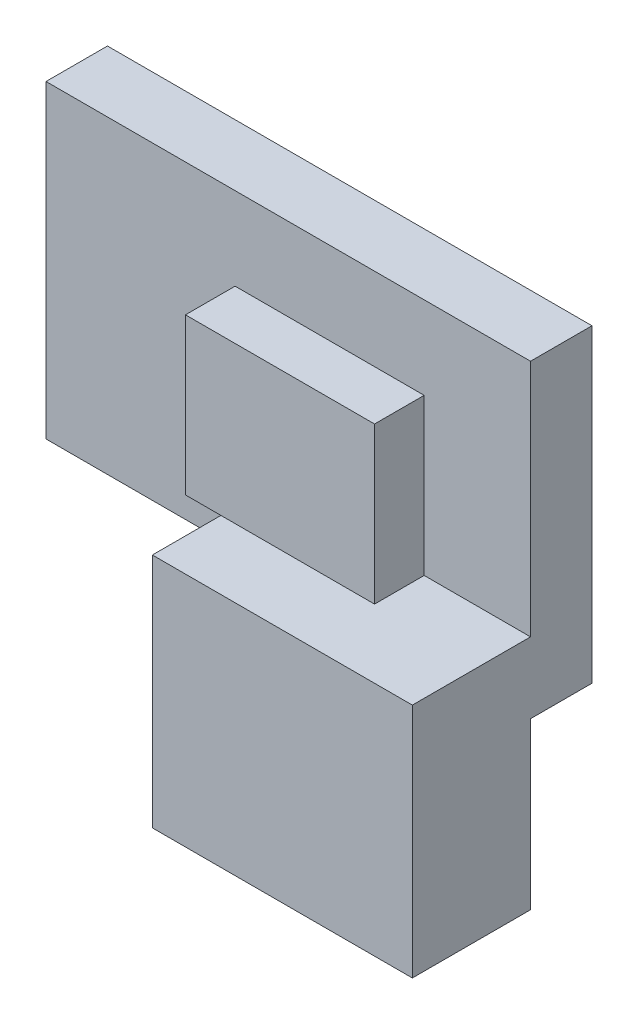
ISO-10303-21;
HEADER;
FILE_DESCRIPTION(('STEP AP214'),'2;1');
FILE_NAME('part.step','',(''),(''),'','','');
FILE_SCHEMA(('AUTOMOTIVE_DESIGN { 1 0 10303 214 1 1 1 1 }'));
ENDSEC;
DATA;
#1=APPLICATION_CONTEXT('core data for automotive mechanical design processes');
#2=APPLICATION_PROTOCOL_DEFINITION('international standard','automotive_design',2000,#1);
#3=PRODUCT_CONTEXT('',#1,'mechanical');
#4=PRODUCT('Part','Part','',(#3));
#5=PRODUCT_RELATED_PRODUCT_CATEGORY('part','',(#4));
#6=PRODUCT_DEFINITION_FORMATION('','',#4);
#7=PRODUCT_DEFINITION_CONTEXT('part definition',#1,'design');
#8=PRODUCT_DEFINITION('design','',#6,#7);
#9=PRODUCT_DEFINITION_SHAPE('','',#8);
#10=(LENGTH_UNIT() NAMED_UNIT(*) SI_UNIT(.MILLI.,.METRE.));
#11=(NAMED_UNIT(*) PLANE_ANGLE_UNIT() SI_UNIT($,.RADIAN.));
#12=(NAMED_UNIT(*) SI_UNIT($,.STERADIAN.) SOLID_ANGLE_UNIT());
#13=UNCERTAINTY_MEASURE_WITH_UNIT(LENGTH_MEASURE(1.E-05),#10,'distance_accuracy_value','');
#14=(GEOMETRIC_REPRESENTATION_CONTEXT(3) GLOBAL_UNCERTAINTY_ASSIGNED_CONTEXT((#13)) GLOBAL_UNIT_ASSIGNED_CONTEXT((#10,
#11,#12)) REPRESENTATION_CONTEXT('',''));
#15=CARTESIAN_POINT('',(0.,0.,0.));
#16=DIRECTION('',(0.,0.,1.));
#17=DIRECTION('',(1.,0.,0.));
#18=AXIS2_PLACEMENT_3D('',#15,#16,#17);
#19=CARTESIAN_POINT('',(0.,0.,1.3));
#20=DIRECTION('',(0.,0.,-1.));
#21=DIRECTION('',(-1.,0.,0.));
#22=AXIS2_PLACEMENT_3D('',#19,#20,#21);
#23=PLANE('',#22);
#24=DIRECTION('',(0.,1.,0.));
#25=VECTOR('',#24,1.);
#26=CARTESIAN_POINT('',(5.75,3.05,1.3));
#27=LINE('',#26,#25);
#28=CARTESIAN_POINT('',(5.75,-3.55,1.3));
#29=VERTEX_POINT('',#28);
#30=CARTESIAN_POINT('',(5.75,3.05,1.3));
#31=VERTEX_POINT('',#30);
#32=EDGE_CURVE('E159',#29,#31,#27,.T.);
#33=ORIENTED_EDGE('',*,*,#32,.F.);
#34=DIRECTION('',(-1.,0.,0.));
#35=VECTOR('',#34,1.);
#36=CARTESIAN_POINT('',(10.25,-3.55,1.3));
#37=LINE('',#36,#35);
#38=CARTESIAN_POINT('',(10.25,-3.55,1.3));
#39=VERTEX_POINT('',#38);
#40=EDGE_CURVE('E63',#39,#29,#37,.T.);
#41=ORIENTED_EDGE('',*,*,#40,.F.);
#42=DIRECTION('',(0.,1.,0.));
#43=VECTOR('',#42,1.);
#44=CARTESIAN_POINT('',(10.25,-6.55,1.3));
#45=LINE('',#44,#43);
#46=CARTESIAN_POINT('',(10.25,6.55,1.3));
#47=VERTEX_POINT('',#46);
#48=EDGE_CURVE('E199',#39,#47,#45,.T.);
#49=ORIENTED_EDGE('',*,*,#48,.T.);
#50=DIRECTION('',(-1.,0.,0.));
#51=VECTOR('',#50,1.);
#52=CARTESIAN_POINT('',(-10.25,6.55,1.3));
#53=LINE('',#52,#51);
#54=CARTESIAN_POINT('',(-10.25,6.55,1.3));
#55=VERTEX_POINT('',#54);
#56=EDGE_CURVE('E201',#47,#55,#53,.T.);
#57=ORIENTED_EDGE('',*,*,#56,.T.);
#58=DIRECTION('',(0.,-1.,0.));
#59=VECTOR('',#58,1.);
#60=CARTESIAN_POINT('',(-10.25,-6.55,1.3));
#61=LINE('',#60,#59);
#62=CARTESIAN_POINT('',(-10.25,-6.55,1.3));
#63=VERTEX_POINT('',#62);
#64=EDGE_CURVE('E204',#55,#63,#61,.T.);
#65=ORIENTED_EDGE('',*,*,#64,.T.);
#66=DIRECTION('',(1.,0.,0.));
#67=VECTOR('',#66,1.);
#68=CARTESIAN_POINT('',(-10.25,-6.55,1.3));
#69=LINE('',#68,#67);
#70=CARTESIAN_POINT('',(-0.749999999999999,-6.55,1.3));
#71=VERTEX_POINT('',#70);
#72=EDGE_CURVE('E206',#63,#71,#69,.T.);
#73=ORIENTED_EDGE('',*,*,#72,.T.);
#74=DIRECTION('',(0.,-1.,0.));
#75=VECTOR('',#74,1.);
#76=CARTESIAN_POINT('',(-0.749999999999999,-3.55,1.3));
#77=LINE('',#76,#75);
#78=CARTESIAN_POINT('',(-0.749999999999999,-3.55,1.3));
#79=VERTEX_POINT('',#78);
#80=EDGE_CURVE('E182',#79,#71,#77,.T.);
#81=ORIENTED_EDGE('',*,*,#80,.F.);
#82=DIRECTION('',(1.,0.,0.));
#83=VECTOR('',#82,1.);
#84=CARTESIAN_POINT('',(5.75,-3.55,1.3));
#85=LINE('',#84,#83);
#86=CARTESIAN_POINT('',(-2.25,-3.55,1.3));
#87=VERTEX_POINT('',#86);
#88=EDGE_CURVE('E156',#87,#79,#85,.T.);
#89=ORIENTED_EDGE('',*,*,#88,.F.);
#90=DIRECTION('',(0.,-1.,0.));
#91=VECTOR('',#90,1.);
#92=CARTESIAN_POINT('',(-2.25,3.05,1.3));
#93=LINE('',#92,#91);
#94=CARTESIAN_POINT('',(-2.25,3.05,1.3));
#95=VERTEX_POINT('',#94);
#96=EDGE_CURVE('E427',#95,#87,#93,.T.);
#97=ORIENTED_EDGE('',*,*,#96,.F.);
#98=DIRECTION('',(-1.,0.,0.));
#99=VECTOR('',#98,1.);
#100=CARTESIAN_POINT('',(5.75,3.05,1.3));
#101=LINE('',#100,#99);
#102=EDGE_CURVE('E430',#31,#95,#101,.T.);
#103=ORIENTED_EDGE('',*,*,#102,.F.);
#104=EDGE_LOOP('',(#33,#41,#49,#57,#65,#73,#81,#89,#97,#103));
#105=FACE_BOUND('',#104,.T.);
#106=ADVANCED_FACE('F40',(#105),#23,.F.);
#107=CARTESIAN_POINT('',(10.25,-3.55,6.3));
#108=DIRECTION('',(0.,-1.,0.));
#109=DIRECTION('',(1.,0.,0.));
#110=AXIS2_PLACEMENT_3D('',#107,#108,#109);
#111=PLANE('',#110);
#112=DIRECTION('',(0.,0.,-1.));
#113=VECTOR('',#112,1.);
#114=CARTESIAN_POINT('',(5.75,-3.55,3.4));
#115=LINE('',#114,#113);
#116=CARTESIAN_POINT('',(5.75,-3.55,3.4));
#117=VERTEX_POINT('',#116);
#118=EDGE_CURVE('E433',#117,#29,#115,.T.);
#119=ORIENTED_EDGE('',*,*,#118,.F.);
#120=DIRECTION('',(1.,0.,0.));
#121=VECTOR('',#120,1.);
#122=CARTESIAN_POINT('',(5.75,-3.55,3.4));
#123=LINE('',#122,#121);
#124=CARTESIAN_POINT('',(-0.749999999999999,-3.55,3.4));
#125=VERTEX_POINT('',#124);
#126=EDGE_CURVE('E153',#125,#117,#123,.T.);
#127=ORIENTED_EDGE('',*,*,#126,.F.);
#128=DIRECTION('',(0.,0.,-1.));
#129=VECTOR('',#128,1.);
#130=CARTESIAN_POINT('',(-0.749999999999999,-3.55,6.3));
#131=LINE('',#130,#129);
#132=CARTESIAN_POINT('',(-0.749999999999999,-3.55,6.3));
#133=VERTEX_POINT('',#132);
#134=EDGE_CURVE('E192',#133,#125,#131,.T.);
#135=ORIENTED_EDGE('',*,*,#134,.F.);
#136=DIRECTION('',(-1.,0.,0.));
#137=VECTOR('',#136,1.);
#138=CARTESIAN_POINT('',(10.25,-3.55,6.3));
#139=LINE('',#138,#137);
#140=CARTESIAN_POINT('',(10.25,-3.55,6.3));
#141=VERTEX_POINT('',#140);
#142=EDGE_CURVE('E172',#141,#133,#139,.T.);
#143=ORIENTED_EDGE('',*,*,#142,.F.);
#144=DIRECTION('',(0.,0.,-1.));
#145=VECTOR('',#144,1.);
#146=CARTESIAN_POINT('',(10.25,-3.55,6.3));
#147=LINE('',#146,#145);
#148=EDGE_CURVE('E195',#141,#39,#147,.T.);
#149=ORIENTED_EDGE('',*,*,#148,.T.);
#150=ORIENTED_EDGE('',*,*,#40,.T.);
#151=EDGE_LOOP('',(#119,#127,#135,#143,#149,#150));
#152=FACE_BOUND('',#151,.T.);
#153=ADVANCED_FACE('F253',(#152),#111,.F.);
#154=CARTESIAN_POINT('',(10.25,-6.55,1.3));
#155=DIRECTION('',(-1.,0.,0.));
#156=DIRECTION('',(0.,0.,1.));
#157=AXIS2_PLACEMENT_3D('',#154,#155,#156);
#158=PLANE('',#157);
#159=DIRECTION('',(0.,1.,0.));
#160=VECTOR('',#159,1.);
#161=CARTESIAN_POINT('',(10.25,-6.55,-1.3));
#162=LINE('',#161,#160);
#163=CARTESIAN_POINT('',(10.25,-6.55,-1.3));
#164=VERTEX_POINT('',#163);
#165=CARTESIAN_POINT('',(10.25,6.55,-1.3));
#166=VERTEX_POINT('',#165);
#167=EDGE_CURVE('E198',#164,#166,#162,.T.);
#168=ORIENTED_EDGE('',*,*,#167,.T.);
#169=DIRECTION('',(0.,0.,-1.));
#170=VECTOR('',#169,1.);
#171=CARTESIAN_POINT('',(10.25,6.55,1.3));
#172=LINE('',#171,#170);
#173=EDGE_CURVE('E11',#47,#166,#172,.T.);
#174=ORIENTED_EDGE('',*,*,#173,.F.);
#175=ORIENTED_EDGE('',*,*,#48,.F.);
#176=ORIENTED_EDGE('',*,*,#148,.F.);
#177=DIRECTION('',(0.,1.,0.));
#178=VECTOR('',#177,1.);
#179=CARTESIAN_POINT('',(10.25,-3.55,6.3));
#180=LINE('',#179,#178);
#181=CARTESIAN_POINT('',(10.25,-13.55,6.3));
#182=VERTEX_POINT('',#181);
#183=EDGE_CURVE('E169',#182,#141,#180,.T.);
#184=ORIENTED_EDGE('',*,*,#183,.F.);
#185=DIRECTION('',(0.,0.,-1.));
#186=VECTOR('',#185,1.);
#187=CARTESIAN_POINT('',(10.25,-13.55,6.3));
#188=LINE('',#187,#186);
#189=CARTESIAN_POINT('',(10.25,-13.55,1.3));
#190=VERTEX_POINT('',#189);
#191=EDGE_CURVE('E178',#182,#190,#188,.T.);
#192=ORIENTED_EDGE('',*,*,#191,.T.);
#193=DIRECTION('',(0.,1.,0.));
#194=VECTOR('',#193,1.);
#195=CARTESIAN_POINT('',(10.25,-3.55,1.3));
#196=LINE('',#195,#194);
#197=CARTESIAN_POINT('',(10.25,-6.55,1.3));
#198=VERTEX_POINT('',#197);
#199=EDGE_CURVE('E161',#190,#198,#196,.T.);
#200=ORIENTED_EDGE('',*,*,#199,.T.);
#201=DIRECTION('',(0.,0.,-1.));
#202=VECTOR('',#201,1.);
#203=CARTESIAN_POINT('',(10.25,-6.55,1.3));
#204=LINE('',#203,#202);
#205=EDGE_CURVE('E208',#198,#164,#204,.T.);
#206=ORIENTED_EDGE('',*,*,#205,.T.);
#207=EDGE_LOOP('',(#168,#174,#175,#176,#184,#192,#200,#206));
#208=FACE_BOUND('',#207,.T.);
#209=ADVANCED_FACE('F42',(#208),#158,.F.);
#210=CARTESIAN_POINT('',(-10.25,6.55,1.3));
#211=DIRECTION('',(0.,-1.,0.));
#212=DIRECTION('',(0.,0.,-1.));
#213=AXIS2_PLACEMENT_3D('',#210,#211,#212);
#214=PLANE('',#213);
#215=DIRECTION('',(-1.,0.,0.));
#216=VECTOR('',#215,1.);
#217=CARTESIAN_POINT('',(-10.25,6.55,-1.3));
#218=LINE('',#217,#216);
#219=CARTESIAN_POINT('',(-10.25,6.55,-1.3));
#220=VERTEX_POINT('',#219);
#221=EDGE_CURVE('E211',#166,#220,#218,.T.);
#222=ORIENTED_EDGE('',*,*,#221,.T.);
#223=DIRECTION('',(0.,0.,-1.));
#224=VECTOR('',#223,1.);
#225=CARTESIAN_POINT('',(-10.25,6.55,1.3));
#226=LINE('',#225,#224);
#227=EDGE_CURVE('E48',#55,#220,#226,.T.);
#228=ORIENTED_EDGE('',*,*,#227,.F.);
#229=ORIENTED_EDGE('',*,*,#56,.F.);
#230=ORIENTED_EDGE('',*,*,#173,.T.);
#231=EDGE_LOOP('',(#222,#228,#229,#230));
#232=FACE_BOUND('',#231,.T.);
#233=ADVANCED_FACE('F250',(#232),#214,.F.);
#234=CARTESIAN_POINT('',(-10.25,-6.55,1.3));
#235=DIRECTION('',(1.,0.,0.));
#236=DIRECTION('',(0.,0.,-1.));
#237=AXIS2_PLACEMENT_3D('',#234,#235,#236);
#238=PLANE('',#237);
#239=DIRECTION('',(0.,-1.,0.));
#240=VECTOR('',#239,1.);
#241=CARTESIAN_POINT('',(-10.25,-6.55,-1.3));
#242=LINE('',#241,#240);
#243=CARTESIAN_POINT('',(-10.25,-6.55,-1.3));
#244=VERTEX_POINT('',#243);
#245=EDGE_CURVE('E213',#220,#244,#242,.T.);
#246=ORIENTED_EDGE('',*,*,#245,.T.);
#247=DIRECTION('',(0.,0.,-1.));
#248=VECTOR('',#247,1.);
#249=CARTESIAN_POINT('',(-10.25,-6.55,1.3));
#250=LINE('',#249,#248);
#251=EDGE_CURVE('E218',#63,#244,#250,.T.);
#252=ORIENTED_EDGE('',*,*,#251,.F.);
#253=ORIENTED_EDGE('',*,*,#64,.F.);
#254=ORIENTED_EDGE('',*,*,#227,.T.);
#255=EDGE_LOOP('',(#246,#252,#253,#254));
#256=FACE_BOUND('',#255,.T.);
#257=ADVANCED_FACE('F225',(#256),#238,.F.);
#258=CARTESIAN_POINT('',(-10.25,-6.55,1.3));
#259=DIRECTION('',(0.,1.,0.));
#260=DIRECTION('',(0.,0.,1.));
#261=AXIS2_PLACEMENT_3D('',#258,#259,#260);
#262=PLANE('',#261);
#263=DIRECTION('',(1.,0.,0.));
#264=VECTOR('',#263,1.);
#265=CARTESIAN_POINT('',(-10.25,-6.55,-1.3));
#266=LINE('',#265,#264);
#267=EDGE_CURVE('E202',#244,#164,#266,.T.);
#268=ORIENTED_EDGE('',*,*,#267,.T.);
#269=ORIENTED_EDGE('',*,*,#205,.F.);
#270=EDGE_CURVE('E55',#71,#198,#69,.T.);
#271=ORIENTED_EDGE('',*,*,#270,.F.);
#272=ORIENTED_EDGE('',*,*,#72,.F.);
#273=ORIENTED_EDGE('',*,*,#251,.T.);
#274=EDGE_LOOP('',(#268,#269,#271,#272,#273));
#275=FACE_BOUND('',#274,.T.);
#276=ADVANCED_FACE('F233',(#275),#262,.F.);
#277=CARTESIAN_POINT('',(0.,0.,-1.3));
#278=DIRECTION('',(0.,0.,-1.));
#279=DIRECTION('',(-1.,0.,0.));
#280=AXIS2_PLACEMENT_3D('',#277,#278,#279);
#281=PLANE('',#280);
#282=ORIENTED_EDGE('',*,*,#167,.F.);
#283=ORIENTED_EDGE('',*,*,#267,.F.);
#284=ORIENTED_EDGE('',*,*,#245,.F.);
#285=ORIENTED_EDGE('',*,*,#221,.F.);
#286=EDGE_LOOP('',(#282,#283,#284,#285));
#287=FACE_BOUND('',#286,.T.);
#288=ADVANCED_FACE('F232',(#287),#281,.T.);
#289=CARTESIAN_POINT('',(-0.749999999999999,-3.55,6.3));
#290=DIRECTION('',(1.,0.,0.));
#291=DIRECTION('',(0.,1.,0.));
#292=AXIS2_PLACEMENT_3D('',#289,#290,#291);
#293=PLANE('',#292);
#294=ORIENTED_EDGE('',*,*,#80,.T.);
#295=CARTESIAN_POINT('',(-0.749999999999997,-13.55,1.3));
#296=VERTEX_POINT('',#295);
#297=EDGE_CURVE('E181',#71,#296,#77,.T.);
#298=ORIENTED_EDGE('',*,*,#297,.T.);
#299=DIRECTION('',(0.,0.,-1.));
#300=VECTOR('',#299,1.);
#301=CARTESIAN_POINT('',(-0.749999999999997,-13.55,6.3));
#302=LINE('',#301,#300);
#303=CARTESIAN_POINT('',(-0.749999999999997,-13.55,6.3));
#304=VERTEX_POINT('',#303);
#305=EDGE_CURVE('E188',#304,#296,#302,.T.);
#306=ORIENTED_EDGE('',*,*,#305,.F.);
#307=DIRECTION('',(0.,-1.,0.));
#308=VECTOR('',#307,1.);
#309=CARTESIAN_POINT('',(-0.749999999999999,-3.55,6.3));
#310=LINE('',#309,#308);
#311=EDGE_CURVE('E175',#133,#304,#310,.T.);
#312=ORIENTED_EDGE('',*,*,#311,.F.);
#313=ORIENTED_EDGE('',*,*,#134,.T.);
#314=EDGE_CURVE('E191',#125,#79,#131,.T.);
#315=ORIENTED_EDGE('',*,*,#314,.T.);
#316=EDGE_LOOP('',(#294,#298,#306,#312,#313,#315));
#317=FACE_BOUND('',#316,.T.);
#318=ADVANCED_FACE('F247',(#317),#293,.F.);
#319=CARTESIAN_POINT('',(10.25,-13.55,6.3));
#320=DIRECTION('',(0.,1.,0.));
#321=DIRECTION('',(-1.,0.,0.));
#322=AXIS2_PLACEMENT_3D('',#319,#320,#321);
#323=PLANE('',#322);
#324=DIRECTION('',(1.,0.,0.));
#325=VECTOR('',#324,1.);
#326=CARTESIAN_POINT('',(10.25,-13.55,1.3));
#327=LINE('',#326,#325);
#328=EDGE_CURVE('E173',#296,#190,#327,.T.);
#329=ORIENTED_EDGE('',*,*,#328,.T.);
#330=ORIENTED_EDGE('',*,*,#191,.F.);
#331=DIRECTION('',(1.,0.,0.));
#332=VECTOR('',#331,1.);
#333=CARTESIAN_POINT('',(10.25,-13.55,6.3));
#334=LINE('',#333,#332);
#335=EDGE_CURVE('E177',#304,#182,#334,.T.);
#336=ORIENTED_EDGE('',*,*,#335,.F.);
#337=ORIENTED_EDGE('',*,*,#305,.T.);
#338=EDGE_LOOP('',(#329,#330,#336,#337));
#339=FACE_BOUND('',#338,.T.);
#340=ADVANCED_FACE('F260',(#339),#323,.F.);
#341=CARTESIAN_POINT('',(0.,0.,6.3));
#342=DIRECTION('',(0.,0.,-1.));
#343=DIRECTION('',(-1.,0.,0.));
#344=AXIS2_PLACEMENT_3D('',#341,#342,#343);
#345=PLANE('',#344);
#346=ORIENTED_EDGE('',*,*,#183,.T.);
#347=ORIENTED_EDGE('',*,*,#142,.T.);
#348=ORIENTED_EDGE('',*,*,#311,.T.);
#349=ORIENTED_EDGE('',*,*,#335,.T.);
#350=EDGE_LOOP('',(#346,#347,#348,#349));
#351=FACE_BOUND('',#350,.T.);
#352=ADVANCED_FACE('F257',(#351),#345,.F.);
#353=CARTESIAN_POINT('',(0.,0.,1.3));
#354=DIRECTION('',(0.,0.,-1.));
#355=DIRECTION('',(-1.,0.,0.));
#356=AXIS2_PLACEMENT_3D('',#353,#354,#355);
#357=PLANE('',#356);
#358=ORIENTED_EDGE('',*,*,#297,.F.);
#359=ORIENTED_EDGE('',*,*,#270,.T.);
#360=ORIENTED_EDGE('',*,*,#199,.F.);
#361=ORIENTED_EDGE('',*,*,#328,.F.);
#362=EDGE_LOOP('',(#358,#359,#360,#361));
#363=FACE_BOUND('',#362,.T.);
#364=ADVANCED_FACE('F242',(#363),#357,.T.);
#365=CARTESIAN_POINT('',(5.75,-3.55,3.4));
#366=DIRECTION('',(0.,1.,0.));
#367=DIRECTION('',(-1.,0.,0.));
#368=AXIS2_PLACEMENT_3D('',#365,#366,#367);
#369=PLANE('',#368);
#370=ORIENTED_EDGE('',*,*,#88,.T.);
#371=ORIENTED_EDGE('',*,*,#314,.F.);
#372=CARTESIAN_POINT('',(-2.25,-3.55,3.4));
#373=VERTEX_POINT('',#372);
#374=EDGE_CURVE('E432',#373,#125,#123,.T.);
#375=ORIENTED_EDGE('',*,*,#374,.F.);
#376=DIRECTION('',(0.,0.,-1.));
#377=VECTOR('',#376,1.);
#378=CARTESIAN_POINT('',(-2.25,-3.55,3.4));
#379=LINE('',#378,#377);
#380=EDGE_CURVE('E165',#373,#87,#379,.T.);
#381=ORIENTED_EDGE('',*,*,#380,.T.);
#382=EDGE_LOOP('',(#370,#371,#375,#381));
#383=FACE_BOUND('',#382,.T.);
#384=ADVANCED_FACE('F302',(#383),#369,.F.);
#385=CARTESIAN_POINT('',(5.75,3.05,3.4));
#386=DIRECTION('',(-1.,0.,0.));
#387=DIRECTION('',(0.,0.,1.));
#388=AXIS2_PLACEMENT_3D('',#385,#386,#387);
#389=PLANE('',#388);
#390=ORIENTED_EDGE('',*,*,#32,.T.);
#391=DIRECTION('',(0.,0.,-1.));
#392=VECTOR('',#391,1.);
#393=CARTESIAN_POINT('',(5.75,3.05,3.4));
#394=LINE('',#393,#392);
#395=CARTESIAN_POINT('',(5.75,3.05,3.4));
#396=VERTEX_POINT('',#395);
#397=EDGE_CURVE('E140',#396,#31,#394,.T.);
#398=ORIENTED_EDGE('',*,*,#397,.F.);
#399=DIRECTION('',(0.,1.,0.));
#400=VECTOR('',#399,1.);
#401=CARTESIAN_POINT('',(5.75,3.05,3.4));
#402=LINE('',#401,#400);
#403=EDGE_CURVE('E147',#117,#396,#402,.T.);
#404=ORIENTED_EDGE('',*,*,#403,.F.);
#405=ORIENTED_EDGE('',*,*,#118,.T.);
#406=EDGE_LOOP('',(#390,#398,#404,#405));
#407=FACE_BOUND('',#406,.T.);
#408=ADVANCED_FACE('F158',(#407),#389,.F.);
#409=CARTESIAN_POINT('',(5.75,3.05,3.4));
#410=DIRECTION('',(0.,-1.,0.));
#411=DIRECTION('',(1.,0.,0.));
#412=AXIS2_PLACEMENT_3D('',#409,#410,#411);
#413=PLANE('',#412);
#414=ORIENTED_EDGE('',*,*,#102,.T.);
#415=DIRECTION('',(0.,0.,-1.));
#416=VECTOR('',#415,1.);
#417=CARTESIAN_POINT('',(-2.25,3.05,3.4));
#418=LINE('',#417,#416);
#419=CARTESIAN_POINT('',(-2.25,3.05,3.4));
#420=VERTEX_POINT('',#419);
#421=EDGE_CURVE('E143',#420,#95,#418,.T.);
#422=ORIENTED_EDGE('',*,*,#421,.F.);
#423=DIRECTION('',(-1.,0.,0.));
#424=VECTOR('',#423,1.);
#425=CARTESIAN_POINT('',(5.75,3.05,3.4));
#426=LINE('',#425,#424);
#427=EDGE_CURVE('E136',#396,#420,#426,.T.);
#428=ORIENTED_EDGE('',*,*,#427,.F.);
#429=ORIENTED_EDGE('',*,*,#397,.T.);
#430=EDGE_LOOP('',(#414,#422,#428,#429));
#431=FACE_BOUND('',#430,.T.);
#432=ADVANCED_FACE('F138',(#431),#413,.F.);
#433=CARTESIAN_POINT('',(-2.25,3.05,3.4));
#434=DIRECTION('',(1.,0.,0.));
#435=DIRECTION('',(0.,1.,0.));
#436=AXIS2_PLACEMENT_3D('',#433,#434,#435);
#437=PLANE('',#436);
#438=ORIENTED_EDGE('',*,*,#96,.T.);
#439=ORIENTED_EDGE('',*,*,#380,.F.);
#440=DIRECTION('',(0.,-1.,0.));
#441=VECTOR('',#440,1.);
#442=CARTESIAN_POINT('',(-2.25,3.05,3.4));
#443=LINE('',#442,#441);
#444=EDGE_CURVE('E146',#420,#373,#443,.T.);
#445=ORIENTED_EDGE('',*,*,#444,.F.);
#446=ORIENTED_EDGE('',*,*,#421,.T.);
#447=EDGE_LOOP('',(#438,#439,#445,#446));
#448=FACE_BOUND('',#447,.T.);
#449=ADVANCED_FACE('F315',(#448),#437,.F.);
#450=CARTESIAN_POINT('',(0.,0.,3.4));
#451=DIRECTION('',(0.,0.,-1.));
#452=DIRECTION('',(-1.,0.,0.));
#453=AXIS2_PLACEMENT_3D('',#450,#451,#452);
#454=PLANE('',#453);
#455=ORIENTED_EDGE('',*,*,#403,.T.);
#456=ORIENTED_EDGE('',*,*,#427,.T.);
#457=ORIENTED_EDGE('',*,*,#444,.T.);
#458=ORIENTED_EDGE('',*,*,#374,.T.);
#459=ORIENTED_EDGE('',*,*,#126,.T.);
#460=EDGE_LOOP('',(#455,#456,#457,#458,#459));
#461=FACE_BOUND('',#460,.T.);
#462=ADVANCED_FACE('F150',(#461),#454,.F.);
#463=CLOSED_SHELL('',(#106,#153,#209,#233,#257,#276,#288,#318,#340,#352,#364,#384,#408,#432,
#449,#462));
#464=MANIFOLD_SOLID_BREP('B2',#463);
#465=ADVANCED_BREP_SHAPE_REPRESENTATION('',(#18,#464),#14);
#466=SHAPE_DEFINITION_REPRESENTATION(#9,#465);
ENDSEC;
END-ISO-10303-21;
